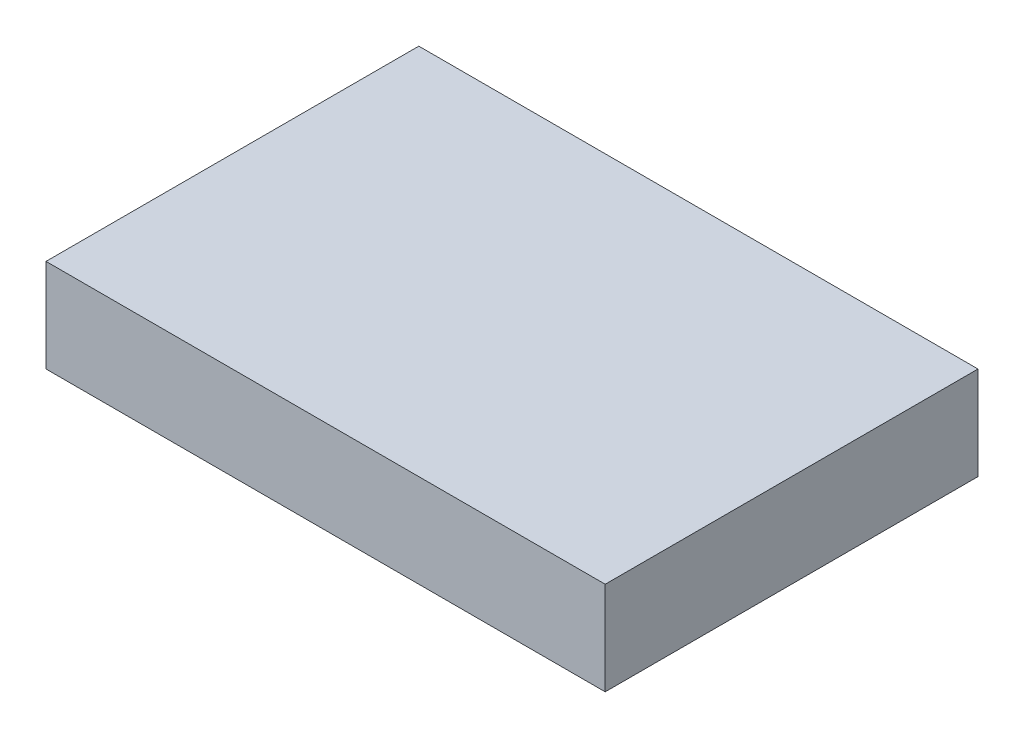
ISO-10303-21;
HEADER;
FILE_DESCRIPTION(('STEP AP214'),'2;1');
FILE_NAME('part.step','',(''),(''),'','','');
FILE_SCHEMA(('AUTOMOTIVE_DESIGN { 1 0 10303 214 1 1 1 1 }'));
ENDSEC;
DATA;
#1=APPLICATION_CONTEXT('core data for automotive mechanical design processes');
#2=APPLICATION_PROTOCOL_DEFINITION('international standard','automotive_design',2000,#1);
#3=PRODUCT_CONTEXT('',#1,'mechanical');
#4=PRODUCT('Part','Part','',(#3));
#5=PRODUCT_RELATED_PRODUCT_CATEGORY('part','',(#4));
#6=PRODUCT_DEFINITION_FORMATION('','',#4);
#7=PRODUCT_DEFINITION_CONTEXT('part definition',#1,'design');
#8=PRODUCT_DEFINITION('design','',#6,#7);
#9=PRODUCT_DEFINITION_SHAPE('','',#8);
#10=(LENGTH_UNIT() NAMED_UNIT(*) SI_UNIT(.MILLI.,.METRE.));
#11=(NAMED_UNIT(*) PLANE_ANGLE_UNIT() SI_UNIT($,.RADIAN.));
#12=(NAMED_UNIT(*) SI_UNIT($,.STERADIAN.) SOLID_ANGLE_UNIT());
#13=UNCERTAINTY_MEASURE_WITH_UNIT(LENGTH_MEASURE(1.E-05),#10,'distance_accuracy_value','');
#14=(GEOMETRIC_REPRESENTATION_CONTEXT(3) GLOBAL_UNCERTAINTY_ASSIGNED_CONTEXT((#13)) GLOBAL_UNIT_ASSIGNED_CONTEXT((#10,
#11,#12)) REPRESENTATION_CONTEXT('',''));
#15=CARTESIAN_POINT('',(0.,0.,0.));
#16=DIRECTION('',(0.,0.,1.));
#17=DIRECTION('',(1.,0.,0.));
#18=AXIS2_PLACEMENT_3D('',#15,#16,#17);
#19=CARTESIAN_POINT('',(-150.,50.,-100.));
#20=DIRECTION('',(0.,0.,-1.));
#21=DIRECTION('',(-1.,0.,0.));
#22=AXIS2_PLACEMENT_3D('',#19,#20,#21);
#23=PLANE('',#22);
#24=DIRECTION('',(1.,0.,0.));
#25=VECTOR('',#24,1.);
#26=CARTESIAN_POINT('',(-150.,0.,-100.));
#27=LINE('',#26,#25);
#28=CARTESIAN_POINT('',(-150.,0.,-100.));
#29=VERTEX_POINT('',#28);
#30=CARTESIAN_POINT('',(150.,0.,-100.));
#31=VERTEX_POINT('',#30);
#32=EDGE_CURVE('E103',#29,#31,#27,.T.);
#33=ORIENTED_EDGE('',*,*,#32,.F.);
#34=DIRECTION('',(0.,-1.,0.));
#35=VECTOR('',#34,1.);
#36=CARTESIAN_POINT('',(-150.,50.,-100.));
#37=LINE('',#36,#35);
#38=CARTESIAN_POINT('',(-150.,50.,-100.));
#39=VERTEX_POINT('',#38);
#40=EDGE_CURVE('E11',#39,#29,#37,.T.);
#41=ORIENTED_EDGE('',*,*,#40,.F.);
#42=DIRECTION('',(1.,0.,0.));
#43=VECTOR('',#42,1.);
#44=CARTESIAN_POINT('',(-150.,50.,-100.));
#45=LINE('',#44,#43);
#46=CARTESIAN_POINT('',(150.,50.,-100.));
#47=VERTEX_POINT('',#46);
#48=EDGE_CURVE('E98',#39,#47,#45,.T.);
#49=ORIENTED_EDGE('',*,*,#48,.T.);
#50=DIRECTION('',(0.,-1.,0.));
#51=VECTOR('',#50,1.);
#52=CARTESIAN_POINT('',(150.,50.,-100.));
#53=LINE('',#52,#51);
#54=EDGE_CURVE('E41',#47,#31,#53,.T.);
#55=ORIENTED_EDGE('',*,*,#54,.T.);
#56=EDGE_LOOP('',(#33,#41,#49,#55));
#57=FACE_BOUND('',#56,.T.);
#58=ADVANCED_FACE('F38',(#57),#23,.T.);
#59=CARTESIAN_POINT('',(-150.,50.,-100.));
#60=DIRECTION('',(1.,0.,0.));
#61=DIRECTION('',(0.,0.,-1.));
#62=AXIS2_PLACEMENT_3D('',#59,#60,#61);
#63=PLANE('',#62);
#64=DIRECTION('',(0.,0.,1.));
#65=VECTOR('',#64,1.);
#66=CARTESIAN_POINT('',(-150.,0.,-100.));
#67=LINE('',#66,#65);
#68=CARTESIAN_POINT('',(-150.,0.,100.));
#69=VERTEX_POINT('',#68);
#70=EDGE_CURVE('E71',#29,#69,#67,.T.);
#71=ORIENTED_EDGE('',*,*,#70,.T.);
#72=DIRECTION('',(0.,-1.,0.));
#73=VECTOR('',#72,1.);
#74=CARTESIAN_POINT('',(-150.,50.,100.));
#75=LINE('',#74,#73);
#76=CARTESIAN_POINT('',(-150.,50.,100.));
#77=VERTEX_POINT('',#76);
#78=EDGE_CURVE('E47',#77,#69,#75,.T.);
#79=ORIENTED_EDGE('',*,*,#78,.F.);
#80=DIRECTION('',(0.,0.,1.));
#81=VECTOR('',#80,1.);
#82=CARTESIAN_POINT('',(-150.,50.,-100.));
#83=LINE('',#82,#81);
#84=EDGE_CURVE('E88',#39,#77,#83,.T.);
#85=ORIENTED_EDGE('',*,*,#84,.F.);
#86=ORIENTED_EDGE('',*,*,#40,.T.);
#87=EDGE_LOOP('',(#71,#79,#85,#86));
#88=FACE_BOUND('',#87,.T.);
#89=ADVANCED_FACE('F113',(#88),#63,.F.);
#90=CARTESIAN_POINT('',(-150.,50.,100.));
#91=DIRECTION('',(0.,0.,-1.));
#92=DIRECTION('',(-1.,0.,0.));
#93=AXIS2_PLACEMENT_3D('',#90,#91,#92);
#94=PLANE('',#93);
#95=DIRECTION('',(1.,0.,0.));
#96=VECTOR('',#95,1.);
#97=CARTESIAN_POINT('',(-150.,0.,100.));
#98=LINE('',#97,#96);
#99=CARTESIAN_POINT('',(150.,0.,100.));
#100=VERTEX_POINT('',#99);
#101=EDGE_CURVE('E95',#69,#100,#98,.T.);
#102=ORIENTED_EDGE('',*,*,#101,.T.);
#103=DIRECTION('',(0.,-1.,0.));
#104=VECTOR('',#103,1.);
#105=CARTESIAN_POINT('',(150.,50.,100.));
#106=LINE('',#105,#104);
#107=CARTESIAN_POINT('',(150.,50.,100.));
#108=VERTEX_POINT('',#107);
#109=EDGE_CURVE('E92',#108,#100,#106,.T.);
#110=ORIENTED_EDGE('',*,*,#109,.F.);
#111=DIRECTION('',(1.,0.,0.));
#112=VECTOR('',#111,1.);
#113=CARTESIAN_POINT('',(-150.,50.,100.));
#114=LINE('',#113,#112);
#115=EDGE_CURVE('E83',#77,#108,#114,.T.);
#116=ORIENTED_EDGE('',*,*,#115,.F.);
#117=ORIENTED_EDGE('',*,*,#78,.T.);
#118=EDGE_LOOP('',(#102,#110,#116,#117));
#119=FACE_BOUND('',#118,.T.);
#120=ADVANCED_FACE('F93',(#119),#94,.F.);
#121=CARTESIAN_POINT('',(150.,50.,-100.));
#122=DIRECTION('',(1.,0.,0.));
#123=DIRECTION('',(0.,0.,-1.));
#124=AXIS2_PLACEMENT_3D('',#121,#122,#123);
#125=PLANE('',#124);
#126=DIRECTION('',(0.,0.,1.));
#127=VECTOR('',#126,1.);
#128=CARTESIAN_POINT('',(150.,0.,-100.));
#129=LINE('',#128,#127);
#130=EDGE_CURVE('E106',#31,#100,#129,.T.);
#131=ORIENTED_EDGE('',*,*,#130,.F.);
#132=ORIENTED_EDGE('',*,*,#54,.F.);
#133=DIRECTION('',(0.,0.,1.));
#134=VECTOR('',#133,1.);
#135=CARTESIAN_POINT('',(150.,50.,-100.));
#136=LINE('',#135,#134);
#137=EDGE_CURVE('E87',#47,#108,#136,.T.);
#138=ORIENTED_EDGE('',*,*,#137,.T.);
#139=ORIENTED_EDGE('',*,*,#109,.T.);
#140=EDGE_LOOP('',(#131,#132,#138,#139));
#141=FACE_BOUND('',#140,.T.);
#142=ADVANCED_FACE('F97',(#141),#125,.T.);
#143=CARTESIAN_POINT('',(0.,50.,0.));
#144=DIRECTION('',(0.,-1.,0.));
#145=DIRECTION('',(0.,0.,-1.));
#146=AXIS2_PLACEMENT_3D('',#143,#144,#145);
#147=PLANE('',#146);
#148=ORIENTED_EDGE('',*,*,#48,.F.);
#149=ORIENTED_EDGE('',*,*,#84,.T.);
#150=ORIENTED_EDGE('',*,*,#115,.T.);
#151=ORIENTED_EDGE('',*,*,#137,.F.);
#152=EDGE_LOOP('',(#148,#149,#150,#151));
#153=FACE_BOUND('',#152,.T.);
#154=ADVANCED_FACE('F86',(#153),#147,.F.);
#155=CARTESIAN_POINT('',(0.,0.,0.));
#156=DIRECTION('',(0.,-1.,0.));
#157=DIRECTION('',(0.,0.,-1.));
#158=AXIS2_PLACEMENT_3D('',#155,#156,#157);
#159=PLANE('',#158);
#160=ORIENTED_EDGE('',*,*,#32,.T.);
#161=ORIENTED_EDGE('',*,*,#130,.T.);
#162=ORIENTED_EDGE('',*,*,#101,.F.);
#163=ORIENTED_EDGE('',*,*,#70,.F.);
#164=EDGE_LOOP('',(#160,#161,#162,#163));
#165=FACE_BOUND('',#164,.T.);
#166=ADVANCED_FACE('F111',(#165),#159,.T.);
#167=CLOSED_SHELL('',(#58,#89,#120,#142,#154,#166));
#168=MANIFOLD_SOLID_BREP('B2',#167);
#169=ADVANCED_BREP_SHAPE_REPRESENTATION('',(#18,#168),#14);
#170=SHAPE_DEFINITION_REPRESENTATION(#9,#169);
ENDSEC;
END-ISO-10303-21;
